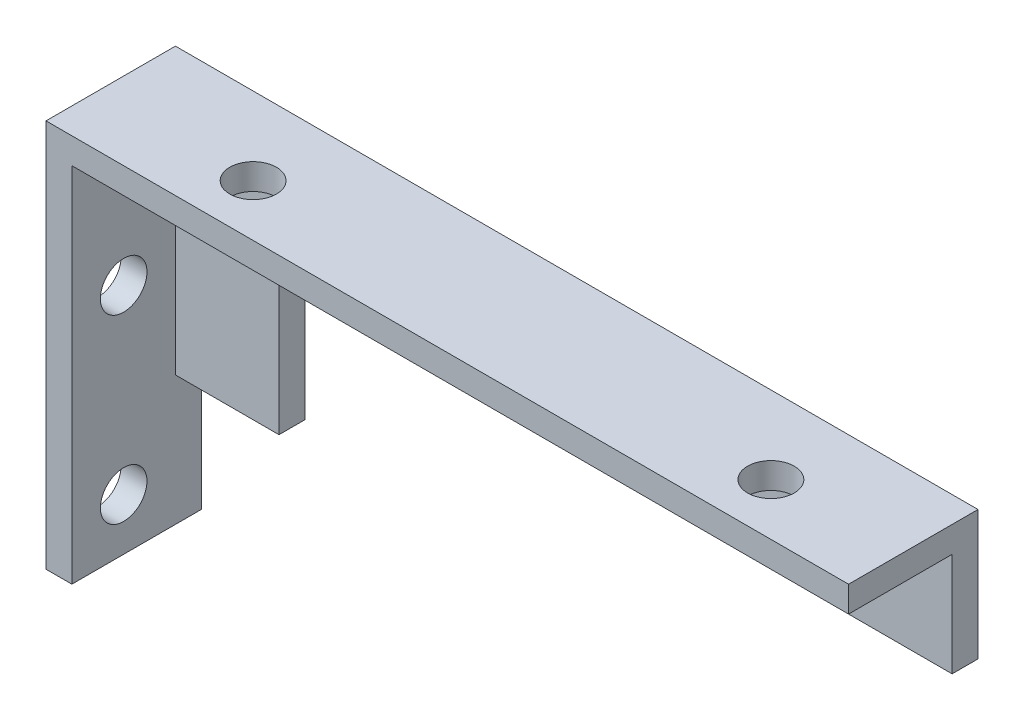
ISO-10303-21;
HEADER;
FILE_DESCRIPTION(('STEP AP214'),'2;1');
FILE_NAME('part.step','',(''),(''),'','','');
FILE_SCHEMA(('AUTOMOTIVE_DESIGN { 1 0 10303 214 1 1 1 1 }'));
ENDSEC;
DATA;
#1=APPLICATION_CONTEXT('core data for automotive mechanical design processes');
#2=APPLICATION_PROTOCOL_DEFINITION('international standard','automotive_design',2000,#1);
#3=PRODUCT_CONTEXT('',#1,'mechanical');
#4=PRODUCT('Part','Part','',(#3));
#5=PRODUCT_RELATED_PRODUCT_CATEGORY('part','',(#4));
#6=PRODUCT_DEFINITION_FORMATION('','',#4);
#7=PRODUCT_DEFINITION_CONTEXT('part definition',#1,'design');
#8=PRODUCT_DEFINITION('design','',#6,#7);
#9=PRODUCT_DEFINITION_SHAPE('','',#8);
#10=(LENGTH_UNIT() NAMED_UNIT(*) SI_UNIT(.MILLI.,.METRE.));
#11=(NAMED_UNIT(*) PLANE_ANGLE_UNIT() SI_UNIT($,.RADIAN.));
#12=(NAMED_UNIT(*) SI_UNIT($,.STERADIAN.) SOLID_ANGLE_UNIT());
#13=UNCERTAINTY_MEASURE_WITH_UNIT(LENGTH_MEASURE(1.E-05),#10,'distance_accuracy_value','');
#14=(GEOMETRIC_REPRESENTATION_CONTEXT(3) GLOBAL_UNCERTAINTY_ASSIGNED_CONTEXT((#13)) GLOBAL_UNIT_ASSIGNED_CONTEXT((#10,
#11,#12)) REPRESENTATION_CONTEXT('',''));
#15=CARTESIAN_POINT('',(0.,0.,0.));
#16=DIRECTION('',(0.,0.,1.));
#17=DIRECTION('',(1.,0.,0.));
#18=AXIS2_PLACEMENT_3D('',#15,#16,#17);
#19=CARTESIAN_POINT('',(0.,0.,5.));
#20=DIRECTION('',(1.,0.,0.));
#21=DIRECTION('',(0.,1.,0.));
#22=AXIS2_PLACEMENT_3D('',#19,#20,#21);
#23=PLANE('',#22);
#24=CARTESIAN_POINT('',(0.,-6.,3.));
#25=DIRECTION('',(1.,0.,0.));
#26=DIRECTION('',(0.,1.,0.));
#27=AXIS2_PLACEMENT_3D('',#24,#25,#26);
#28=CIRCLE('',#27,0.9);
#29=CARTESIAN_POINT('',(0.,-5.1,3.));
#30=VERTEX_POINT('',#29);
#31=EDGE_CURVE('E238',#30,#30,#28,.T.);
#32=ORIENTED_EDGE('',*,*,#31,.T.);
#33=EDGE_LOOP('',(#32));
#34=FACE_BOUND('',#33,.T.);
#35=CARTESIAN_POINT('',(0.,-13.,3.));
#36=DIRECTION('',(1.,0.,0.));
#37=DIRECTION('',(0.,1.,0.));
#38=AXIS2_PLACEMENT_3D('',#35,#36,#37);
#39=CIRCLE('',#38,0.9);
#40=CARTESIAN_POINT('',(0.,-12.1,3.));
#41=VERTEX_POINT('',#40);
#42=EDGE_CURVE('E251',#41,#41,#39,.T.);
#43=ORIENTED_EDGE('',*,*,#42,.T.);
#44=EDGE_LOOP('',(#43));
#45=FACE_BOUND('',#44,.T.);
#46=DIRECTION('',(0.,-1.,0.));
#47=VECTOR('',#46,1.);
#48=CARTESIAN_POINT('',(0.,0.,0.));
#49=LINE('',#48,#47);
#50=CARTESIAN_POINT('',(0.,0.,0.));
#51=VERTEX_POINT('',#50);
#52=CARTESIAN_POINT('',(0.,-15.,0.));
#53=VERTEX_POINT('',#52);
#54=EDGE_CURVE('E181',#51,#53,#49,.T.);
#55=ORIENTED_EDGE('',*,*,#54,.T.);
#56=DIRECTION('',(0.,0.,-1.));
#57=VECTOR('',#56,1.);
#58=CARTESIAN_POINT('',(0.,-15.,5.));
#59=LINE('',#58,#57);
#60=CARTESIAN_POINT('',(0.,-15.,5.));
#61=VERTEX_POINT('',#60);
#62=EDGE_CURVE('E11',#61,#53,#59,.T.);
#63=ORIENTED_EDGE('',*,*,#62,.F.);
#64=DIRECTION('',(0.,-1.,0.));
#65=VECTOR('',#64,1.);
#66=CARTESIAN_POINT('',(0.,0.,5.));
#67=LINE('',#66,#65);
#68=CARTESIAN_POINT('',(0.,0.,5.));
#69=VERTEX_POINT('',#68);
#70=EDGE_CURVE('E196',#69,#61,#67,.T.);
#71=ORIENTED_EDGE('',*,*,#70,.F.);
#72=DIRECTION('',(0.,0.,-1.));
#73=VECTOR('',#72,1.);
#74=CARTESIAN_POINT('',(0.,0.,5.));
#75=LINE('',#74,#73);
#76=EDGE_CURVE('E197',#69,#51,#75,.T.);
#77=ORIENTED_EDGE('',*,*,#76,.T.);
#78=EDGE_LOOP('',(#55,#63,#71,#77));
#79=FACE_BOUND('',#78,.T.);
#80=ADVANCED_FACE('F38',(#34,#45,#79),#23,.F.);
#81=CARTESIAN_POINT('',(0.,-15.,5.));
#82=DIRECTION('',(0.,1.,0.));
#83=DIRECTION('',(0.,0.,1.));
#84=AXIS2_PLACEMENT_3D('',#81,#82,#83);
#85=PLANE('',#84);
#86=DIRECTION('',(1.,0.,0.));
#87=VECTOR('',#86,1.);
#88=CARTESIAN_POINT('',(0.,-15.,0.));
#89=LINE('',#88,#87);
#90=CARTESIAN_POINT('',(1.,-15.,0.));
#91=VERTEX_POINT('',#90);
#92=EDGE_CURVE('E174',#53,#91,#89,.T.);
#93=ORIENTED_EDGE('',*,*,#92,.T.);
#94=DIRECTION('',(0.,0.,-1.));
#95=VECTOR('',#94,1.);
#96=CARTESIAN_POINT('',(1.,-15.,5.));
#97=LINE('',#96,#95);
#98=CARTESIAN_POINT('',(1.,-15.,5.));
#99=VERTEX_POINT('',#98);
#100=EDGE_CURVE('E46',#99,#91,#97,.T.);
#101=ORIENTED_EDGE('',*,*,#100,.F.);
#102=DIRECTION('',(1.,0.,0.));
#103=VECTOR('',#102,1.);
#104=CARTESIAN_POINT('',(0.,-15.,5.));
#105=LINE('',#104,#103);
#106=EDGE_CURVE('E102',#61,#99,#105,.T.);
#107=ORIENTED_EDGE('',*,*,#106,.F.);
#108=ORIENTED_EDGE('',*,*,#62,.T.);
#109=EDGE_LOOP('',(#93,#101,#107,#108));
#110=FACE_BOUND('',#109,.T.);
#111=ADVANCED_FACE('F291',(#110),#85,.F.);
#112=CARTESIAN_POINT('',(1.,-15.,5.));
#113=DIRECTION('',(-1.,0.,0.));
#114=DIRECTION('',(0.,0.,1.));
#115=AXIS2_PLACEMENT_3D('',#112,#113,#114);
#116=PLANE('',#115);
#117=CARTESIAN_POINT('',(1.,-6.,3.));
#118=DIRECTION('',(1.,0.,0.));
#119=DIRECTION('',(0.,0.,-1.));
#120=AXIS2_PLACEMENT_3D('',#117,#118,#119);
#121=CIRCLE('',#120,0.9);
#122=CARTESIAN_POINT('',(1.,-6.,2.1));
#123=VERTEX_POINT('',#122);
#124=EDGE_CURVE('E255',#123,#123,#121,.T.);
#125=ORIENTED_EDGE('',*,*,#124,.F.);
#126=EDGE_LOOP('',(#125));
#127=FACE_BOUND('',#126,.T.);
#128=CARTESIAN_POINT('',(1.,-13.,3.));
#129=DIRECTION('',(1.,0.,0.));
#130=DIRECTION('',(0.,0.,-1.));
#131=AXIS2_PLACEMENT_3D('',#128,#129,#130);
#132=CIRCLE('',#131,0.9);
#133=CARTESIAN_POINT('',(1.,-13.,2.1));
#134=VERTEX_POINT('',#133);
#135=EDGE_CURVE('E256',#134,#134,#132,.T.);
#136=ORIENTED_EDGE('',*,*,#135,.F.);
#137=EDGE_LOOP('',(#136));
#138=FACE_BOUND('',#137,.T.);
#139=DIRECTION('',(0.,1.,0.));
#140=VECTOR('',#139,1.);
#141=CARTESIAN_POINT('',(1.,-15.,0.));
#142=LINE('',#141,#140);
#143=CARTESIAN_POINT('',(1.,-10.,0.));
#144=VERTEX_POINT('',#143);
#145=EDGE_CURVE('E168',#91,#144,#142,.T.);
#146=ORIENTED_EDGE('',*,*,#145,.T.);
#147=DIRECTION('',(0.,0.,-1.));
#148=VECTOR('',#147,1.);
#149=CARTESIAN_POINT('',(1.,-10.,5.));
#150=LINE('',#149,#148);
#151=CARTESIAN_POINT('',(1.,-10.,1.));
#152=VERTEX_POINT('',#151);
#153=EDGE_CURVE('E153',#152,#144,#150,.T.);
#154=ORIENTED_EDGE('',*,*,#153,.F.);
#155=DIRECTION('',(0.,-1.,0.));
#156=VECTOR('',#155,1.);
#157=CARTESIAN_POINT('',(1.,-10.,1.));
#158=LINE('',#157,#156);
#159=CARTESIAN_POINT('',(1.,-1.,1.));
#160=VERTEX_POINT('',#159);
#161=EDGE_CURVE('E131',#160,#152,#158,.T.);
#162=ORIENTED_EDGE('',*,*,#161,.F.);
#163=DIRECTION('',(0.,0.,1.));
#164=VECTOR('',#163,1.);
#165=CARTESIAN_POINT('',(1.,-1.,1.));
#166=LINE('',#165,#164);
#167=CARTESIAN_POINT('',(1.,-1.,5.));
#168=VERTEX_POINT('',#167);
#169=EDGE_CURVE('E219',#160,#168,#166,.T.);
#170=ORIENTED_EDGE('',*,*,#169,.T.);
#171=DIRECTION('',(0.,1.,0.));
#172=VECTOR('',#171,1.);
#173=CARTESIAN_POINT('',(1.,-15.,5.));
#174=LINE('',#173,#172);
#175=EDGE_CURVE('E170',#99,#168,#174,.T.);
#176=ORIENTED_EDGE('',*,*,#175,.F.);
#177=ORIENTED_EDGE('',*,*,#100,.T.);
#178=EDGE_LOOP('',(#146,#154,#162,#170,#176,#177));
#179=FACE_BOUND('',#178,.T.);
#180=ADVANCED_FACE('F167',(#127,#138,#179),#116,.F.);
#181=CARTESIAN_POINT('',(1.,-10.,5.));
#182=DIRECTION('',(0.,1.,0.));
#183=DIRECTION('',(0.,0.,1.));
#184=AXIS2_PLACEMENT_3D('',#181,#182,#183);
#185=PLANE('',#184);
#186=DIRECTION('',(0.,0.,-1.));
#187=VECTOR('',#186,1.);
#188=CARTESIAN_POINT('',(5.,-10.,5.));
#189=LINE('',#188,#187);
#190=CARTESIAN_POINT('',(5.,-10.,1.));
#191=VERTEX_POINT('',#190);
#192=CARTESIAN_POINT('',(5.,-10.,0.));
#193=VERTEX_POINT('',#192);
#194=EDGE_CURVE('E142',#191,#193,#189,.T.);
#195=ORIENTED_EDGE('',*,*,#194,.F.);
#196=DIRECTION('',(1.,0.,0.));
#197=VECTOR('',#196,1.);
#198=CARTESIAN_POINT('',(5.,-10.,1.));
#199=LINE('',#198,#197);
#200=EDGE_CURVE('E124',#152,#191,#199,.T.);
#201=ORIENTED_EDGE('',*,*,#200,.F.);
#202=ORIENTED_EDGE('',*,*,#153,.T.);
#203=DIRECTION('',(1.,0.,0.));
#204=VECTOR('',#203,1.);
#205=CARTESIAN_POINT('',(1.,-10.,0.));
#206=LINE('',#205,#204);
#207=EDGE_CURVE('E150',#144,#193,#206,.T.);
#208=ORIENTED_EDGE('',*,*,#207,.T.);
#209=EDGE_LOOP('',(#195,#201,#202,#208));
#210=FACE_BOUND('',#209,.T.);
#211=ADVANCED_FACE('F148',(#210),#185,.F.);
#212=CARTESIAN_POINT('',(5.,-10.,5.));
#213=DIRECTION('',(-1.,0.,0.));
#214=DIRECTION('',(0.,-1.,0.));
#215=AXIS2_PLACEMENT_3D('',#212,#213,#214);
#216=PLANE('',#215);
#217=DIRECTION('',(0.,0.,-1.));
#218=VECTOR('',#217,1.);
#219=CARTESIAN_POINT('',(5.,-5.,5.));
#220=LINE('',#219,#218);
#221=CARTESIAN_POINT('',(5.,-5.,1.));
#222=VERTEX_POINT('',#221);
#223=CARTESIAN_POINT('',(5.,-5.,0.));
#224=VERTEX_POINT('',#223);
#225=EDGE_CURVE('E144',#222,#224,#220,.T.);
#226=ORIENTED_EDGE('',*,*,#225,.F.);
#227=DIRECTION('',(0.,1.,0.));
#228=VECTOR('',#227,1.);
#229=CARTESIAN_POINT('',(5.,-5.,1.));
#230=LINE('',#229,#228);
#231=EDGE_CURVE('E127',#191,#222,#230,.T.);
#232=ORIENTED_EDGE('',*,*,#231,.F.);
#233=ORIENTED_EDGE('',*,*,#194,.T.);
#234=DIRECTION('',(0.,1.,0.));
#235=VECTOR('',#234,1.);
#236=CARTESIAN_POINT('',(5.,-10.,0.));
#237=LINE('',#236,#235);
#238=EDGE_CURVE('E179',#193,#224,#237,.T.);
#239=ORIENTED_EDGE('',*,*,#238,.T.);
#240=EDGE_LOOP('',(#226,#232,#233,#239));
#241=FACE_BOUND('',#240,.T.);
#242=ADVANCED_FACE('F140',(#241),#216,.F.);
#243=CARTESIAN_POINT('',(31.,-5.,5.));
#244=DIRECTION('',(0.,1.,0.));
#245=DIRECTION('',(-1.,0.,0.));
#246=AXIS2_PLACEMENT_3D('',#243,#244,#245);
#247=PLANE('',#246);
#248=DIRECTION('',(0.,0.,-1.));
#249=VECTOR('',#248,1.);
#250=CARTESIAN_POINT('',(31.,-5.,5.));
#251=LINE('',#250,#249);
#252=CARTESIAN_POINT('',(31.,-5.,1.));
#253=VERTEX_POINT('',#252);
#254=CARTESIAN_POINT('',(31.,-5.,0.));
#255=VERTEX_POINT('',#254);
#256=EDGE_CURVE('E158',#253,#255,#251,.T.);
#257=ORIENTED_EDGE('',*,*,#256,.F.);
#258=DIRECTION('',(1.,0.,0.));
#259=VECTOR('',#258,1.);
#260=CARTESIAN_POINT('',(31.,-5.,1.));
#261=LINE('',#260,#259);
#262=EDGE_CURVE('E146',#222,#253,#261,.T.);
#263=ORIENTED_EDGE('',*,*,#262,.F.);
#264=ORIENTED_EDGE('',*,*,#225,.T.);
#265=DIRECTION('',(1.,0.,0.));
#266=VECTOR('',#265,1.);
#267=CARTESIAN_POINT('',(31.,-5.,0.));
#268=LINE('',#267,#266);
#269=EDGE_CURVE('E187',#224,#255,#268,.T.);
#270=ORIENTED_EDGE('',*,*,#269,.T.);
#271=EDGE_LOOP('',(#257,#263,#264,#270));
#272=FACE_BOUND('',#271,.T.);
#273=ADVANCED_FACE('F214',(#272),#247,.F.);
#274=CARTESIAN_POINT('',(31.,0.,5.));
#275=DIRECTION('',(-1.,0.,0.));
#276=DIRECTION('',(0.,-1.,0.));
#277=AXIS2_PLACEMENT_3D('',#274,#275,#276);
#278=PLANE('',#277);
#279=DIRECTION('',(0.,1.,0.));
#280=VECTOR('',#279,1.);
#281=CARTESIAN_POINT('',(31.,0.,5.));
#282=LINE('',#281,#280);
#283=CARTESIAN_POINT('',(31.,-1.,5.));
#284=VERTEX_POINT('',#283);
#285=CARTESIAN_POINT('',(31.,0.,5.));
#286=VERTEX_POINT('',#285);
#287=EDGE_CURVE('E225',#284,#286,#282,.T.);
#288=ORIENTED_EDGE('',*,*,#287,.F.);
#289=DIRECTION('',(0.,0.,1.));
#290=VECTOR('',#289,1.);
#291=CARTESIAN_POINT('',(31.,-1.,1.));
#292=LINE('',#291,#290);
#293=CARTESIAN_POINT('',(31.,-1.,1.));
#294=VERTEX_POINT('',#293);
#295=EDGE_CURVE('E53',#294,#284,#292,.T.);
#296=ORIENTED_EDGE('',*,*,#295,.F.);
#297=DIRECTION('',(0.,1.,0.));
#298=VECTOR('',#297,1.);
#299=CARTESIAN_POINT('',(31.,-1.,1.));
#300=LINE('',#299,#298);
#301=EDGE_CURVE('E211',#253,#294,#300,.T.);
#302=ORIENTED_EDGE('',*,*,#301,.F.);
#303=ORIENTED_EDGE('',*,*,#256,.T.);
#304=DIRECTION('',(0.,1.,0.));
#305=VECTOR('',#304,1.);
#306=CARTESIAN_POINT('',(31.,0.,0.));
#307=LINE('',#306,#305);
#308=CARTESIAN_POINT('',(31.,0.,0.));
#309=VERTEX_POINT('',#308);
#310=EDGE_CURVE('E191',#255,#309,#307,.T.);
#311=ORIENTED_EDGE('',*,*,#310,.T.);
#312=DIRECTION('',(0.,0.,-1.));
#313=VECTOR('',#312,1.);
#314=CARTESIAN_POINT('',(31.,0.,5.));
#315=LINE('',#314,#313);
#316=EDGE_CURVE('E200',#286,#309,#315,.T.);
#317=ORIENTED_EDGE('',*,*,#316,.F.);
#318=EDGE_LOOP('',(#288,#296,#302,#303,#311,#317));
#319=FACE_BOUND('',#318,.T.);
#320=ADVANCED_FACE('F207',(#319),#278,.F.);
#321=CARTESIAN_POINT('',(0.,0.,5.));
#322=DIRECTION('',(0.,-1.,0.));
#323=DIRECTION('',(0.,0.,-1.));
#324=AXIS2_PLACEMENT_3D('',#321,#322,#323);
#325=PLANE('',#324);
#326=CARTESIAN_POINT('',(6.,0.,3.));
#327=DIRECTION('',(0.,-1.,0.));
#328=DIRECTION('',(0.,0.,-1.));
#329=AXIS2_PLACEMENT_3D('',#326,#327,#328);
#330=CIRCLE('',#329,0.9);
#331=CARTESIAN_POINT('',(6.,0.,2.1));
#332=VERTEX_POINT('',#331);
#333=EDGE_CURVE('E260',#332,#332,#330,.T.);
#334=ORIENTED_EDGE('',*,*,#333,.T.);
#335=EDGE_LOOP('',(#334));
#336=FACE_BOUND('',#335,.T.);
#337=CARTESIAN_POINT('',(26.,0.,3.));
#338=DIRECTION('',(0.,-1.,0.));
#339=DIRECTION('',(0.,0.,-1.));
#340=AXIS2_PLACEMENT_3D('',#337,#338,#339);
#341=CIRCLE('',#340,0.9);
#342=CARTESIAN_POINT('',(26.,0.,2.1));
#343=VERTEX_POINT('',#342);
#344=EDGE_CURVE('E267',#343,#343,#341,.T.);
#345=ORIENTED_EDGE('',*,*,#344,.T.);
#346=EDGE_LOOP('',(#345));
#347=FACE_BOUND('',#346,.T.);
#348=DIRECTION('',(-1.,0.,0.));
#349=VECTOR('',#348,1.);
#350=CARTESIAN_POINT('',(0.,0.,0.));
#351=LINE('',#350,#349);
#352=EDGE_CURVE('E95',#309,#51,#351,.T.);
#353=ORIENTED_EDGE('',*,*,#352,.T.);
#354=ORIENTED_EDGE('',*,*,#76,.F.);
#355=DIRECTION('',(-1.,0.,0.));
#356=VECTOR('',#355,1.);
#357=CARTESIAN_POINT('',(0.,0.,5.));
#358=LINE('',#357,#356);
#359=EDGE_CURVE('E62',#286,#69,#358,.T.);
#360=ORIENTED_EDGE('',*,*,#359,.F.);
#361=ORIENTED_EDGE('',*,*,#316,.T.);
#362=EDGE_LOOP('',(#353,#354,#360,#361));
#363=FACE_BOUND('',#362,.T.);
#364=ADVANCED_FACE('F289',(#336,#347,#363),#325,.F.);
#365=CARTESIAN_POINT('',(0.,0.,5.));
#366=DIRECTION('',(0.,0.,1.));
#367=DIRECTION('',(1.,0.,0.));
#368=AXIS2_PLACEMENT_3D('',#365,#366,#367);
#369=PLANE('',#368);
#370=ORIENTED_EDGE('',*,*,#175,.T.);
#371=DIRECTION('',(-1.,0.,0.));
#372=VECTOR('',#371,1.);
#373=CARTESIAN_POINT('',(1.,-1.,5.));
#374=LINE('',#373,#372);
#375=EDGE_CURVE('E136',#284,#168,#374,.T.);
#376=ORIENTED_EDGE('',*,*,#375,.F.);
#377=ORIENTED_EDGE('',*,*,#287,.T.);
#378=ORIENTED_EDGE('',*,*,#359,.T.);
#379=ORIENTED_EDGE('',*,*,#70,.T.);
#380=ORIENTED_EDGE('',*,*,#106,.T.);
#381=EDGE_LOOP('',(#370,#376,#377,#378,#379,#380));
#382=FACE_BOUND('',#381,.T.);
#383=ADVANCED_FACE('F288',(#382),#369,.T.);
#384=CARTESIAN_POINT('',(0.,0.,0.));
#385=DIRECTION('',(0.,0.,1.));
#386=DIRECTION('',(1.,0.,0.));
#387=AXIS2_PLACEMENT_3D('',#384,#385,#386);
#388=PLANE('',#387);
#389=ORIENTED_EDGE('',*,*,#54,.F.);
#390=ORIENTED_EDGE('',*,*,#352,.F.);
#391=ORIENTED_EDGE('',*,*,#310,.F.);
#392=ORIENTED_EDGE('',*,*,#269,.F.);
#393=ORIENTED_EDGE('',*,*,#238,.F.);
#394=ORIENTED_EDGE('',*,*,#207,.F.);
#395=ORIENTED_EDGE('',*,*,#145,.F.);
#396=ORIENTED_EDGE('',*,*,#92,.F.);
#397=EDGE_LOOP('',(#389,#390,#391,#392,#393,#394,#395,#396));
#398=FACE_BOUND('',#397,.T.);
#399=ADVANCED_FACE('F173',(#398),#388,.F.);
#400=CARTESIAN_POINT('',(1.,-1.,1.));
#401=DIRECTION('',(0.,1.,0.));
#402=DIRECTION('',(0.,0.,1.));
#403=AXIS2_PLACEMENT_3D('',#400,#401,#402);
#404=PLANE('',#403);
#405=CARTESIAN_POINT('',(6.,-1.,3.));
#406=DIRECTION('',(0.,-1.,0.));
#407=DIRECTION('',(0.,0.,-1.));
#408=AXIS2_PLACEMENT_3D('',#405,#406,#407);
#409=CIRCLE('',#408,0.9);
#410=CARTESIAN_POINT('',(6.,-1.,2.1));
#411=VERTEX_POINT('',#410);
#412=EDGE_CURVE('E271',#411,#411,#409,.T.);
#413=ORIENTED_EDGE('',*,*,#412,.F.);
#414=EDGE_LOOP('',(#413));
#415=FACE_BOUND('',#414,.T.);
#416=CARTESIAN_POINT('',(26.,-1.,3.));
#417=DIRECTION('',(0.,-1.,0.));
#418=DIRECTION('',(0.,0.,-1.));
#419=AXIS2_PLACEMENT_3D('',#416,#417,#418);
#420=CIRCLE('',#419,0.9);
#421=CARTESIAN_POINT('',(26.,-1.,2.1));
#422=VERTEX_POINT('',#421);
#423=EDGE_CURVE('E272',#422,#422,#420,.T.);
#424=ORIENTED_EDGE('',*,*,#423,.F.);
#425=EDGE_LOOP('',(#424));
#426=FACE_BOUND('',#425,.T.);
#427=ORIENTED_EDGE('',*,*,#375,.T.);
#428=ORIENTED_EDGE('',*,*,#169,.F.);
#429=DIRECTION('',(-1.,0.,0.));
#430=VECTOR('',#429,1.);
#431=CARTESIAN_POINT('',(1.,-1.,1.));
#432=LINE('',#431,#430);
#433=EDGE_CURVE('E241',#294,#160,#432,.T.);
#434=ORIENTED_EDGE('',*,*,#433,.F.);
#435=ORIENTED_EDGE('',*,*,#295,.T.);
#436=EDGE_LOOP('',(#427,#428,#434,#435));
#437=FACE_BOUND('',#436,.T.);
#438=ADVANCED_FACE('F283',(#415,#426,#437),#404,.F.);
#439=CARTESIAN_POINT('',(0.,0.,1.));
#440=DIRECTION('',(0.,0.,-1.));
#441=DIRECTION('',(-1.,0.,0.));
#442=AXIS2_PLACEMENT_3D('',#439,#440,#441);
#443=PLANE('',#442);
#444=ORIENTED_EDGE('',*,*,#200,.T.);
#445=ORIENTED_EDGE('',*,*,#231,.T.);
#446=ORIENTED_EDGE('',*,*,#262,.T.);
#447=ORIENTED_EDGE('',*,*,#301,.T.);
#448=ORIENTED_EDGE('',*,*,#433,.T.);
#449=ORIENTED_EDGE('',*,*,#161,.T.);
#450=EDGE_LOOP('',(#444,#445,#446,#447,#448,#449));
#451=FACE_BOUND('',#450,.T.);
#452=ADVANCED_FACE('F126',(#451),#443,.F.);
#453=CARTESIAN_POINT('',(-9.,-13.,3.));
#454=DIRECTION('',(1.,0.,0.));
#455=DIRECTION('',(0.,0.,-1.));
#456=AXIS2_PLACEMENT_3D('',#453,#454,#455);
#457=CYLINDRICAL_SURFACE('',#456,0.9);
#458=ORIENTED_EDGE('',*,*,#135,.T.);
#459=EDGE_LOOP('',(#458));
#460=FACE_BOUND('',#459,.T.);
#461=ORIENTED_EDGE('',*,*,#42,.F.);
#462=EDGE_LOOP('',(#461));
#463=FACE_BOUND('',#462,.T.);
#464=ADVANCED_FACE('F320',(#460,#463),#457,.F.);
#465=CARTESIAN_POINT('',(-9.,-6.,3.));
#466=DIRECTION('',(1.,0.,0.));
#467=DIRECTION('',(0.,0.,-1.));
#468=AXIS2_PLACEMENT_3D('',#465,#466,#467);
#469=CYLINDRICAL_SURFACE('',#468,0.9);
#470=ORIENTED_EDGE('',*,*,#124,.T.);
#471=EDGE_LOOP('',(#470));
#472=FACE_BOUND('',#471,.T.);
#473=ORIENTED_EDGE('',*,*,#31,.F.);
#474=EDGE_LOOP('',(#473));
#475=FACE_BOUND('',#474,.T.);
#476=ADVANCED_FACE('F323',(#472,#475),#469,.F.);
#477=CARTESIAN_POINT('',(26.,9.,3.));
#478=DIRECTION('',(0.,-1.,0.));
#479=DIRECTION('',(0.,0.,-1.));
#480=AXIS2_PLACEMENT_3D('',#477,#478,#479);
#481=CYLINDRICAL_SURFACE('',#480,0.9);
#482=ORIENTED_EDGE('',*,*,#423,.T.);
#483=EDGE_LOOP('',(#482));
#484=FACE_BOUND('',#483,.T.);
#485=ORIENTED_EDGE('',*,*,#344,.F.);
#486=EDGE_LOOP('',(#485));
#487=FACE_BOUND('',#486,.T.);
#488=ADVANCED_FACE('F327',(#484,#487),#481,.F.);
#489=CARTESIAN_POINT('',(6.,9.,3.));
#490=DIRECTION('',(0.,-1.,0.));
#491=DIRECTION('',(0.,0.,-1.));
#492=AXIS2_PLACEMENT_3D('',#489,#490,#491);
#493=CYLINDRICAL_SURFACE('',#492,0.9);
#494=ORIENTED_EDGE('',*,*,#412,.T.);
#495=EDGE_LOOP('',(#494));
#496=FACE_BOUND('',#495,.T.);
#497=ORIENTED_EDGE('',*,*,#333,.F.);
#498=EDGE_LOOP('',(#497));
#499=FACE_BOUND('',#498,.T.);
#500=ADVANCED_FACE('F280',(#496,#499),#493,.F.);
#501=CLOSED_SHELL('',(#80,#111,#180,#211,#242,#273,#320,#364,#383,#399,#438,#452,#464,#476,#488,#500));
#502=MANIFOLD_SOLID_BREP('B2',#501);
#503=ADVANCED_BREP_SHAPE_REPRESENTATION('',(#18,#502),#14);
#504=SHAPE_DEFINITION_REPRESENTATION(#9,#503);
ENDSEC;
END-ISO-10303-21;
